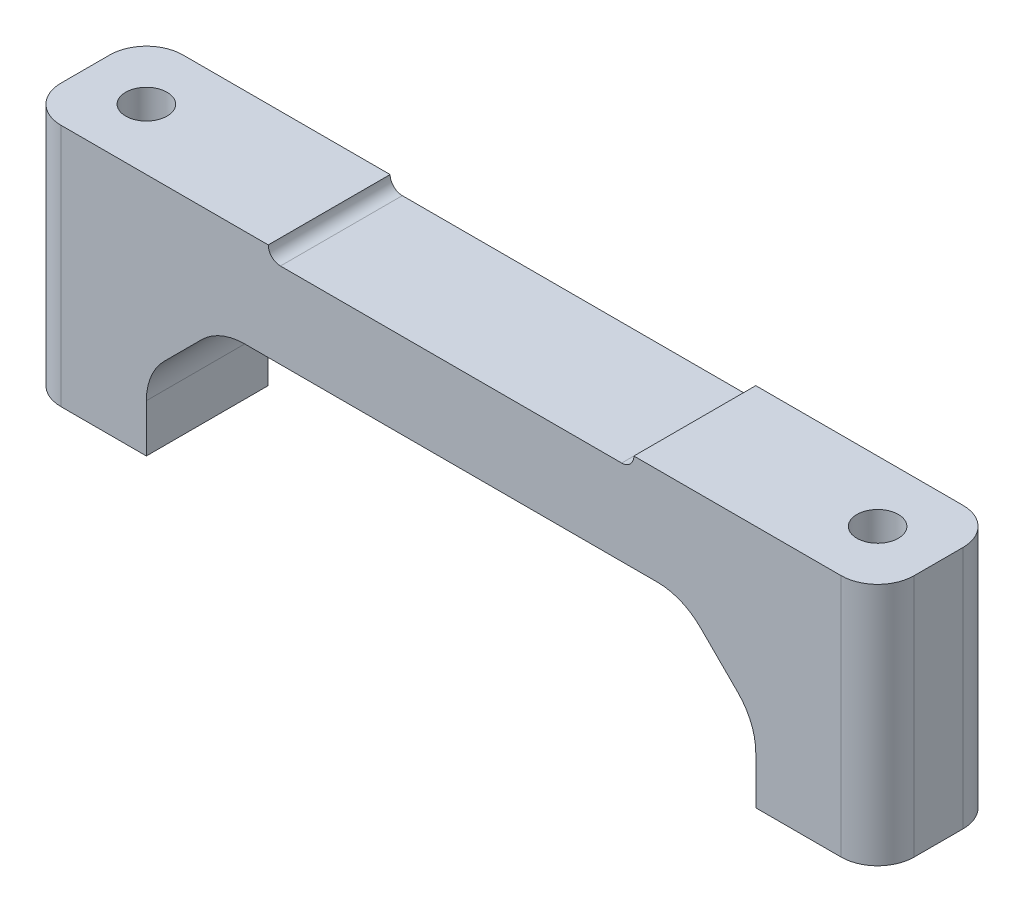
ISO-10303-21;
HEADER;
FILE_DESCRIPTION(('STEP AP214'),'2;1');
FILE_NAME('part.step','',(''),(''),'','','');
FILE_SCHEMA(('AUTOMOTIVE_DESIGN { 1 0 10303 214 1 1 1 1 }'));
ENDSEC;
DATA;
#1=APPLICATION_CONTEXT('core data for automotive mechanical design processes');
#2=APPLICATION_PROTOCOL_DEFINITION('international standard','automotive_design',2000,#1);
#3=PRODUCT_CONTEXT('',#1,'mechanical');
#4=PRODUCT('Part','Part','',(#3));
#5=PRODUCT_RELATED_PRODUCT_CATEGORY('part','',(#4));
#6=PRODUCT_DEFINITION_FORMATION('','',#4);
#7=PRODUCT_DEFINITION_CONTEXT('part definition',#1,'design');
#8=PRODUCT_DEFINITION('design','',#6,#7);
#9=PRODUCT_DEFINITION_SHAPE('','',#8);
#10=(LENGTH_UNIT() NAMED_UNIT(*) SI_UNIT(.MILLI.,.METRE.));
#11=(NAMED_UNIT(*) PLANE_ANGLE_UNIT() SI_UNIT($,.RADIAN.));
#12=(NAMED_UNIT(*) SI_UNIT($,.STERADIAN.) SOLID_ANGLE_UNIT());
#13=UNCERTAINTY_MEASURE_WITH_UNIT(LENGTH_MEASURE(1.E-05),#10,'distance_accuracy_value','');
#14=(GEOMETRIC_REPRESENTATION_CONTEXT(3) GLOBAL_UNCERTAINTY_ASSIGNED_CONTEXT((#13)) GLOBAL_UNIT_ASSIGNED_CONTEXT((#10,
#11,#12)) REPRESENTATION_CONTEXT('',''));
#15=CARTESIAN_POINT('',(0.,0.,0.));
#16=DIRECTION('',(0.,0.,1.));
#17=DIRECTION('',(1.,0.,0.));
#18=AXIS2_PLACEMENT_3D('',#15,#16,#17);
#19=CARTESIAN_POINT('',(0.,20.,0.));
#20=DIRECTION('',(0.,-1.,0.));
#21=DIRECTION('',(0.,0.,-1.));
#22=AXIS2_PLACEMENT_3D('',#19,#20,#21);
#23=PLANE('',#22);
#24=CARTESIAN_POINT('',(30.,20.,0.));
#25=DIRECTION('',(0.,1.,0.));
#26=DIRECTION('',(0.,0.,-1.));
#27=AXIS2_PLACEMENT_3D('',#24,#25,#26);
#28=CIRCLE('',#27,1.7);
#29=CARTESIAN_POINT('',(30.,20.,-1.7));
#30=VERTEX_POINT('',#29);
#31=EDGE_CURVE('E244',#30,#30,#28,.T.);
#32=ORIENTED_EDGE('',*,*,#31,.F.);
#33=EDGE_LOOP('',(#32));
#34=FACE_BOUND('',#33,.T.);
#35=DIRECTION('',(1.,0.,0.));
#36=VECTOR('',#35,1.);
#37=CARTESIAN_POINT('',(-35.,20.,5.));
#38=LINE('',#37,#36);
#39=CARTESIAN_POINT('',(15.0000000000001,20.,5.));
#40=VERTEX_POINT('',#39);
#41=CARTESIAN_POINT('',(32.,20.,5.));
#42=VERTEX_POINT('',#41);
#43=EDGE_CURVE('E264',#40,#42,#38,.T.);
#44=ORIENTED_EDGE('',*,*,#43,.T.);
#45=CARTESIAN_POINT('',(32.,20.,2.));
#46=DIRECTION('',(0.,-1.,0.));
#47=DIRECTION('',(0.,0.,-1.));
#48=AXIS2_PLACEMENT_3D('',#45,#46,#47);
#49=CIRCLE('',#48,3.);
#50=CARTESIAN_POINT('',(35.,20.,2.));
#51=VERTEX_POINT('',#50);
#52=EDGE_CURVE('E329',#42,#51,#49,.F.);
#53=ORIENTED_EDGE('',*,*,#52,.T.);
#54=DIRECTION('',(0.,0.,-1.));
#55=VECTOR('',#54,1.);
#56=CARTESIAN_POINT('',(35.,20.,5.));
#57=LINE('',#56,#55);
#58=CARTESIAN_POINT('',(35.,20.,-1.99999999999999));
#59=VERTEX_POINT('',#58);
#60=EDGE_CURVE('E259',#51,#59,#57,.T.);
#61=ORIENTED_EDGE('',*,*,#60,.T.);
#62=CARTESIAN_POINT('',(32.,20.,-1.99999999999999));
#63=DIRECTION('',(0.,-1.,0.));
#64=DIRECTION('',(0.,0.,-1.));
#65=AXIS2_PLACEMENT_3D('',#62,#63,#64);
#66=CIRCLE('',#65,3.);
#67=CARTESIAN_POINT('',(32.,20.,-4.99999999999999));
#68=VERTEX_POINT('',#67);
#69=EDGE_CURVE('E199',#59,#68,#66,.F.);
#70=ORIENTED_EDGE('',*,*,#69,.T.);
#71=DIRECTION('',(-1.,0.,0.));
#72=VECTOR('',#71,1.);
#73=CARTESIAN_POINT('',(-35.,20.,-4.99999999999999));
#74=LINE('',#73,#72);
#75=CARTESIAN_POINT('',(15.0000000000001,20.,-5.));
#76=VERTEX_POINT('',#75);
#77=EDGE_CURVE('E185',#68,#76,#74,.T.);
#78=ORIENTED_EDGE('',*,*,#77,.T.);
#79=DIRECTION('',(0.,0.,1.));
#80=VECTOR('',#79,1.);
#81=CARTESIAN_POINT('',(15.0000000000001,20.,-5.));
#82=LINE('',#81,#80);
#83=EDGE_CURVE('E195',#76,#40,#82,.T.);
#84=ORIENTED_EDGE('',*,*,#83,.T.);
#85=EDGE_LOOP('',(#44,#53,#61,#70,#78,#84));
#86=FACE_BOUND('',#85,.T.);
#87=ADVANCED_FACE('F33',(#34,#86),#23,.F.);
#88=CARTESIAN_POINT('',(0.,0.,0.));
#89=DIRECTION('',(0.,-1.,0.));
#90=DIRECTION('',(0.,0.,-1.));
#91=AXIS2_PLACEMENT_3D('',#88,#89,#90);
#92=PLANE('',#91);
#93=DIRECTION('',(0.,0.,1.));
#94=VECTOR('',#93,1.);
#95=CARTESIAN_POINT('',(-35.,0.,5.));
#96=LINE('',#95,#94);
#97=CARTESIAN_POINT('',(-35.,0.,-1.99999999999999));
#98=VERTEX_POINT('',#97);
#99=CARTESIAN_POINT('',(-35.,0.,2.));
#100=VERTEX_POINT('',#99);
#101=EDGE_CURVE('E274',#98,#100,#96,.T.);
#102=ORIENTED_EDGE('',*,*,#101,.F.);
#103=CARTESIAN_POINT('',(-32.,0.,-1.99999999999999));
#104=DIRECTION('',(0.,-1.,0.));
#105=DIRECTION('',(0.,0.,-1.));
#106=AXIS2_PLACEMENT_3D('',#103,#104,#105);
#107=CIRCLE('',#106,3.);
#108=CARTESIAN_POINT('',(-32.,0.,-4.99999999999999));
#109=VERTEX_POINT('',#108);
#110=EDGE_CURVE('E342',#98,#109,#107,.T.);
#111=ORIENTED_EDGE('',*,*,#110,.T.);
#112=DIRECTION('',(-1.,0.,0.));
#113=VECTOR('',#112,1.);
#114=CARTESIAN_POINT('',(-35.,0.,-4.99999999999999));
#115=LINE('',#114,#113);
#116=CARTESIAN_POINT('',(-25.,0.,-5.));
#117=VERTEX_POINT('',#116);
#118=EDGE_CURVE('E271',#117,#109,#115,.T.);
#119=ORIENTED_EDGE('',*,*,#118,.F.);
#120=DIRECTION('',(0.,0.,1.));
#121=VECTOR('',#120,1.);
#122=CARTESIAN_POINT('',(-25.,0.,-5.));
#123=LINE('',#122,#121);
#124=CARTESIAN_POINT('',(-25.,0.,5.));
#125=VERTEX_POINT('',#124);
#126=EDGE_CURVE('E228',#117,#125,#123,.T.);
#127=ORIENTED_EDGE('',*,*,#126,.T.);
#128=DIRECTION('',(1.,0.,0.));
#129=VECTOR('',#128,1.);
#130=CARTESIAN_POINT('',(-35.,0.,5.));
#131=LINE('',#130,#129);
#132=CARTESIAN_POINT('',(-32.,0.,5.));
#133=VERTEX_POINT('',#132);
#134=EDGE_CURVE('E260',#133,#125,#131,.T.);
#135=ORIENTED_EDGE('',*,*,#134,.F.);
#136=CARTESIAN_POINT('',(-32.,0.,2.));
#137=DIRECTION('',(0.,-1.,0.));
#138=DIRECTION('',(0.,0.,-1.));
#139=AXIS2_PLACEMENT_3D('',#136,#137,#138);
#140=CIRCLE('',#139,3.);
#141=EDGE_CURVE('E340',#133,#100,#140,.T.);
#142=ORIENTED_EDGE('',*,*,#141,.T.);
#143=EDGE_LOOP('',(#102,#111,#119,#127,#135,#142));
#144=FACE_BOUND('',#143,.T.);
#145=CARTESIAN_POINT('',(-30.,0.,0.));
#146=DIRECTION('',(0.,1.,0.));
#147=DIRECTION('',(0.,0.,1.));
#148=AXIS2_PLACEMENT_3D('',#145,#146,#147);
#149=CIRCLE('',#148,1.7);
#150=CARTESIAN_POINT('',(-30.,0.,1.7));
#151=VERTEX_POINT('',#150);
#152=EDGE_CURVE('E253',#151,#151,#149,.T.);
#153=ORIENTED_EDGE('',*,*,#152,.T.);
#154=EDGE_LOOP('',(#153));
#155=FACE_BOUND('',#154,.T.);
#156=ADVANCED_FACE('F381',(#144,#155),#92,.T.);
#157=CARTESIAN_POINT('',(35.,20.,5.));
#158=DIRECTION('',(-1.,0.,0.));
#159=DIRECTION('',(0.,0.,1.));
#160=AXIS2_PLACEMENT_3D('',#157,#158,#159);
#161=PLANE('',#160);
#162=ORIENTED_EDGE('',*,*,#60,.F.);
#163=DIRECTION('',(0.,-1.,0.));
#164=VECTOR('',#163,1.);
#165=CARTESIAN_POINT('',(35.,20.,2.));
#166=LINE('',#165,#164);
#167=CARTESIAN_POINT('',(35.,0.,2.));
#168=VERTEX_POINT('',#167);
#169=EDGE_CURVE('E316',#51,#168,#166,.T.);
#170=ORIENTED_EDGE('',*,*,#169,.T.);
#171=DIRECTION('',(0.,0.,-1.));
#172=VECTOR('',#171,1.);
#173=CARTESIAN_POINT('',(35.,0.,5.));
#174=LINE('',#173,#172);
#175=CARTESIAN_POINT('',(35.,0.,-1.99999999999999));
#176=VERTEX_POINT('',#175);
#177=EDGE_CURVE('E256',#168,#176,#174,.T.);
#178=ORIENTED_EDGE('',*,*,#177,.T.);
#179=DIRECTION('',(0.,-1.,0.));
#180=VECTOR('',#179,1.);
#181=CARTESIAN_POINT('',(35.,20.,-1.99999999999999));
#182=LINE('',#181,#180);
#183=EDGE_CURVE('E314',#176,#59,#182,.F.);
#184=ORIENTED_EDGE('',*,*,#183,.T.);
#185=EDGE_LOOP('',(#162,#170,#178,#184));
#186=FACE_BOUND('',#185,.T.);
#187=ADVANCED_FACE('F389',(#186),#161,.F.);
#188=CARTESIAN_POINT('',(-35.,20.,-4.99999999999999));
#189=DIRECTION('',(0.,0.,1.));
#190=DIRECTION('',(1.,0.,0.));
#191=AXIS2_PLACEMENT_3D('',#188,#189,#190);
#192=PLANE('',#191);
#193=ORIENTED_EDGE('',*,*,#77,.F.);
#194=DIRECTION('',(0.,-1.,0.));
#195=VECTOR('',#194,1.);
#196=CARTESIAN_POINT('',(32.,20.,-4.99999999999999));
#197=LINE('',#196,#195);
#198=CARTESIAN_POINT('',(32.,0.,-4.99999999999999));
#199=VERTEX_POINT('',#198);
#200=EDGE_CURVE('E333',#68,#199,#197,.T.);
#201=ORIENTED_EDGE('',*,*,#200,.T.);
#202=CARTESIAN_POINT('',(25.,0.,-4.99999999999999));
#203=VERTEX_POINT('',#202);
#204=EDGE_CURVE('E272',#199,#203,#115,.T.);
#205=ORIENTED_EDGE('',*,*,#204,.T.);
#206=DIRECTION('',(0.,1.,0.));
#207=VECTOR('',#206,1.);
#208=CARTESIAN_POINT('',(25.,0.,-5.));
#209=LINE('',#208,#207);
#210=CARTESIAN_POINT('',(25.,3.92893218813453,-5.));
#211=VERTEX_POINT('',#210);
#212=EDGE_CURVE('E215',#203,#211,#209,.T.);
#213=ORIENTED_EDGE('',*,*,#212,.T.);
#214=CARTESIAN_POINT('',(20.,3.92893218813452,-4.99999999999999));
#215=DIRECTION('',(0.,0.,1.));
#216=DIRECTION('',(1.,0.,0.));
#217=AXIS2_PLACEMENT_3D('',#214,#215,#216);
#218=CIRCLE('',#217,5.);
#219=CARTESIAN_POINT('',(23.5355339059327,7.46446609406727,-5.));
#220=VERTEX_POINT('',#219);
#221=EDGE_CURVE('E300',#211,#220,#218,.T.);
#222=ORIENTED_EDGE('',*,*,#221,.T.);
#223=DIRECTION('',(-0.707106781186548,0.707106781186547,0.));
#224=VECTOR('',#223,1.);
#225=CARTESIAN_POINT('',(25.,6.,-5.));
#226=LINE('',#225,#224);
#227=CARTESIAN_POINT('',(20.4644660940673,10.5355339059327,-5.));
#228=VERTEX_POINT('',#227);
#229=EDGE_CURVE('E219',#220,#228,#226,.T.);
#230=ORIENTED_EDGE('',*,*,#229,.T.);
#231=CARTESIAN_POINT('',(16.9289321881345,7.,-4.99999999999999));
#232=DIRECTION('',(0.,0.,1.));
#233=DIRECTION('',(1.,0.,0.));
#234=AXIS2_PLACEMENT_3D('',#231,#232,#233);
#235=CIRCLE('',#234,5.);
#236=CARTESIAN_POINT('',(16.9289321881345,12.,-5.));
#237=VERTEX_POINT('',#236);
#238=EDGE_CURVE('E304',#228,#237,#235,.T.);
#239=ORIENTED_EDGE('',*,*,#238,.T.);
#240=DIRECTION('',(-1.,0.,0.));
#241=VECTOR('',#240,1.);
#242=CARTESIAN_POINT('',(-19.,12.,-5.));
#243=LINE('',#242,#241);
#244=CARTESIAN_POINT('',(-16.9289321881345,12.,-5.));
#245=VERTEX_POINT('',#244);
#246=EDGE_CURVE('E222',#237,#245,#243,.T.);
#247=ORIENTED_EDGE('',*,*,#246,.T.);
#248=CARTESIAN_POINT('',(-16.9289321881345,7.,-4.99999999999999));
#249=DIRECTION('',(0.,0.,1.));
#250=DIRECTION('',(1.,0.,0.));
#251=AXIS2_PLACEMENT_3D('',#248,#249,#250);
#252=CIRCLE('',#251,5.);
#253=CARTESIAN_POINT('',(-20.4644660940673,10.5355339059327,-5.));
#254=VERTEX_POINT('',#253);
#255=EDGE_CURVE('E312',#245,#254,#252,.T.);
#256=ORIENTED_EDGE('',*,*,#255,.T.);
#257=DIRECTION('',(-0.707106781186547,-0.707106781186548,0.));
#258=VECTOR('',#257,1.);
#259=CARTESIAN_POINT('',(-25.,6.,-5.));
#260=LINE('',#259,#258);
#261=CARTESIAN_POINT('',(-23.5355339059327,7.46446609406726,-5.));
#262=VERTEX_POINT('',#261);
#263=EDGE_CURVE('E225',#254,#262,#260,.T.);
#264=ORIENTED_EDGE('',*,*,#263,.T.);
#265=CARTESIAN_POINT('',(-20.,3.92893218813453,-4.99999999999999));
#266=DIRECTION('',(0.,0.,1.));
#267=DIRECTION('',(1.,0.,0.));
#268=AXIS2_PLACEMENT_3D('',#265,#266,#267);
#269=CIRCLE('',#268,5.);
#270=CARTESIAN_POINT('',(-25.,3.92893218813453,-5.));
#271=VERTEX_POINT('',#270);
#272=EDGE_CURVE('E308',#262,#271,#269,.T.);
#273=ORIENTED_EDGE('',*,*,#272,.T.);
#274=DIRECTION('',(0.,-1.,0.));
#275=VECTOR('',#274,1.);
#276=CARTESIAN_POINT('',(-25.,0.,-5.));
#277=LINE('',#276,#275);
#278=EDGE_CURVE('E213',#271,#117,#277,.T.);
#279=ORIENTED_EDGE('',*,*,#278,.T.);
#280=ORIENTED_EDGE('',*,*,#118,.T.);
#281=DIRECTION('',(0.,-1.,0.));
#282=VECTOR('',#281,1.);
#283=CARTESIAN_POINT('',(-32.,20.,-4.99999999999999));
#284=LINE('',#283,#282);
#285=CARTESIAN_POINT('',(-32.,20.,-4.99999999999999));
#286=VERTEX_POINT('',#285);
#287=EDGE_CURVE('E331',#109,#286,#284,.F.);
#288=ORIENTED_EDGE('',*,*,#287,.T.);
#289=CARTESIAN_POINT('',(-14.9999999999999,20.,-4.99999999999999));
#290=VERTEX_POINT('',#289);
#291=EDGE_CURVE('E201',#290,#286,#74,.T.);
#292=ORIENTED_EDGE('',*,*,#291,.F.);
#293=CARTESIAN_POINT('',(-13.9999999999999,20.,-4.99999999999999));
#294=DIRECTION('',(0.,0.,1.));
#295=DIRECTION('',(1.,0.,0.));
#296=AXIS2_PLACEMENT_3D('',#293,#294,#295);
#297=CIRCLE('',#296,1.);
#298=CARTESIAN_POINT('',(-13.9999999999999,19.,-5.));
#299=VERTEX_POINT('',#298);
#300=EDGE_CURVE('E11',#290,#299,#297,.T.);
#301=ORIENTED_EDGE('',*,*,#300,.T.);
#302=DIRECTION('',(1.,0.,0.));
#303=VECTOR('',#302,1.);
#304=CARTESIAN_POINT('',(-14.9999999999999,19.,-5.));
#305=LINE('',#304,#303);
#306=CARTESIAN_POINT('',(14.0000000000001,19.,-5.));
#307=VERTEX_POINT('',#306);
#308=EDGE_CURVE('E187',#299,#307,#305,.T.);
#309=ORIENTED_EDGE('',*,*,#308,.T.);
#310=CARTESIAN_POINT('',(14.0000000000001,20.,-4.99999999999999));
#311=DIRECTION('',(0.,0.,1.));
#312=DIRECTION('',(1.,0.,0.));
#313=AXIS2_PLACEMENT_3D('',#310,#311,#312);
#314=CIRCLE('',#313,1.);
#315=EDGE_CURVE('E181',#307,#76,#314,.T.);
#316=ORIENTED_EDGE('',*,*,#315,.T.);
#317=EDGE_LOOP('',(#193,#201,#205,#213,#222,#230,#239,#247,#256,#264,#273,#279,#280,#288,#292,
#301,#309,#316));
#318=FACE_BOUND('',#317,.T.);
#319=ADVANCED_FACE('F183',(#318),#192,.F.);
#320=CARTESIAN_POINT('',(-35.,20.,5.));
#321=DIRECTION('',(1.,0.,0.));
#322=DIRECTION('',(0.,0.,-1.));
#323=AXIS2_PLACEMENT_3D('',#320,#321,#322);
#324=PLANE('',#323);
#325=DIRECTION('',(0.,0.,1.));
#326=VECTOR('',#325,1.);
#327=CARTESIAN_POINT('',(-35.,20.,5.));
#328=LINE('',#327,#326);
#329=CARTESIAN_POINT('',(-35.,20.,-1.99999999999999));
#330=VERTEX_POINT('',#329);
#331=CARTESIAN_POINT('',(-35.,20.,2.));
#332=VERTEX_POINT('',#331);
#333=EDGE_CURVE('E200',#330,#332,#328,.T.);
#334=ORIENTED_EDGE('',*,*,#333,.F.);
#335=DIRECTION('',(0.,-1.,0.));
#336=VECTOR('',#335,1.);
#337=CARTESIAN_POINT('',(-35.,20.,-1.99999999999999));
#338=LINE('',#337,#336);
#339=EDGE_CURVE('E337',#330,#98,#338,.T.);
#340=ORIENTED_EDGE('',*,*,#339,.T.);
#341=ORIENTED_EDGE('',*,*,#101,.T.);
#342=DIRECTION('',(0.,-1.,0.));
#343=VECTOR('',#342,1.);
#344=CARTESIAN_POINT('',(-35.,20.,2.));
#345=LINE('',#344,#343);
#346=EDGE_CURVE('E335',#100,#332,#345,.F.);
#347=ORIENTED_EDGE('',*,*,#346,.T.);
#348=EDGE_LOOP('',(#334,#340,#341,#347));
#349=FACE_BOUND('',#348,.T.);
#350=ADVANCED_FACE('F403',(#349),#324,.F.);
#351=CARTESIAN_POINT('',(-35.,20.,5.));
#352=DIRECTION('',(0.,0.,-1.));
#353=DIRECTION('',(-1.,0.,0.));
#354=AXIS2_PLACEMENT_3D('',#351,#352,#353);
#355=PLANE('',#354);
#356=CARTESIAN_POINT('',(25.,0.,5.));
#357=VERTEX_POINT('',#356);
#358=CARTESIAN_POINT('',(32.,0.,5.));
#359=VERTEX_POINT('',#358);
#360=EDGE_CURVE('E277',#357,#359,#131,.T.);
#361=ORIENTED_EDGE('',*,*,#360,.T.);
#362=DIRECTION('',(0.,-1.,0.));
#363=VECTOR('',#362,1.);
#364=CARTESIAN_POINT('',(32.,20.,5.));
#365=LINE('',#364,#363);
#366=EDGE_CURVE('E326',#359,#42,#365,.F.);
#367=ORIENTED_EDGE('',*,*,#366,.T.);
#368=ORIENTED_EDGE('',*,*,#43,.F.);
#369=CARTESIAN_POINT('',(14.0000000000001,20.,5.));
#370=DIRECTION('',(0.,0.,-1.));
#371=DIRECTION('',(-1.,0.,0.));
#372=AXIS2_PLACEMENT_3D('',#369,#370,#371);
#373=CIRCLE('',#372,1.);
#374=CARTESIAN_POINT('',(14.0000000000001,19.,5.));
#375=VERTEX_POINT('',#374);
#376=EDGE_CURVE('E190',#40,#375,#373,.T.);
#377=ORIENTED_EDGE('',*,*,#376,.T.);
#378=DIRECTION('',(1.,0.,0.));
#379=VECTOR('',#378,1.);
#380=CARTESIAN_POINT('',(-14.9999999999999,19.,5.));
#381=LINE('',#380,#379);
#382=CARTESIAN_POINT('',(-13.9999999999999,19.,5.));
#383=VERTEX_POINT('',#382);
#384=EDGE_CURVE('E209',#383,#375,#381,.T.);
#385=ORIENTED_EDGE('',*,*,#384,.F.);
#386=CARTESIAN_POINT('',(-13.9999999999999,20.,5.));
#387=DIRECTION('',(0.,0.,-1.));
#388=DIRECTION('',(-1.,0.,0.));
#389=AXIS2_PLACEMENT_3D('',#386,#387,#388);
#390=CIRCLE('',#389,1.);
#391=CARTESIAN_POINT('',(-14.9999999999999,20.,5.));
#392=VERTEX_POINT('',#391);
#393=EDGE_CURVE('E41',#383,#392,#390,.T.);
#394=ORIENTED_EDGE('',*,*,#393,.T.);
#395=CARTESIAN_POINT('',(-32.,20.,5.));
#396=VERTEX_POINT('',#395);
#397=EDGE_CURVE('E265',#396,#392,#38,.T.);
#398=ORIENTED_EDGE('',*,*,#397,.F.);
#399=DIRECTION('',(0.,-1.,0.));
#400=VECTOR('',#399,1.);
#401=CARTESIAN_POINT('',(-32.,20.,5.));
#402=LINE('',#401,#400);
#403=EDGE_CURVE('E323',#396,#133,#402,.T.);
#404=ORIENTED_EDGE('',*,*,#403,.T.);
#405=ORIENTED_EDGE('',*,*,#134,.T.);
#406=DIRECTION('',(0.,-1.,0.));
#407=VECTOR('',#406,1.);
#408=CARTESIAN_POINT('',(-25.,0.,5.));
#409=LINE('',#408,#407);
#410=CARTESIAN_POINT('',(-25.,3.92893218813453,5.));
#411=VERTEX_POINT('',#410);
#412=EDGE_CURVE('E207',#411,#125,#409,.T.);
#413=ORIENTED_EDGE('',*,*,#412,.F.);
#414=CARTESIAN_POINT('',(-20.,3.92893218813453,5.));
#415=DIRECTION('',(0.,0.,-1.));
#416=DIRECTION('',(-1.,0.,0.));
#417=AXIS2_PLACEMENT_3D('',#414,#415,#416);
#418=CIRCLE('',#417,5.);
#419=CARTESIAN_POINT('',(-23.5355339059327,7.46446609406726,5.));
#420=VERTEX_POINT('',#419);
#421=EDGE_CURVE('E306',#411,#420,#418,.T.);
#422=ORIENTED_EDGE('',*,*,#421,.T.);
#423=DIRECTION('',(-0.707106781186547,-0.707106781186548,0.));
#424=VECTOR('',#423,1.);
#425=CARTESIAN_POINT('',(-25.,6.,5.));
#426=LINE('',#425,#424);
#427=CARTESIAN_POINT('',(-20.4644660940673,10.5355339059327,5.));
#428=VERTEX_POINT('',#427);
#429=EDGE_CURVE('E216',#428,#420,#426,.T.);
#430=ORIENTED_EDGE('',*,*,#429,.F.);
#431=CARTESIAN_POINT('',(-16.9289321881345,7.,5.));
#432=DIRECTION('',(0.,0.,-1.));
#433=DIRECTION('',(-1.,0.,0.));
#434=AXIS2_PLACEMENT_3D('',#431,#432,#433);
#435=CIRCLE('',#434,5.);
#436=CARTESIAN_POINT('',(-16.9289321881345,12.,5.));
#437=VERTEX_POINT('',#436);
#438=EDGE_CURVE('E310',#428,#437,#435,.T.);
#439=ORIENTED_EDGE('',*,*,#438,.T.);
#440=DIRECTION('',(-1.,0.,0.));
#441=VECTOR('',#440,1.);
#442=CARTESIAN_POINT('',(-19.,12.,5.));
#443=LINE('',#442,#441);
#444=CARTESIAN_POINT('',(16.9289321881345,12.,5.));
#445=VERTEX_POINT('',#444);
#446=EDGE_CURVE('E237',#445,#437,#443,.T.);
#447=ORIENTED_EDGE('',*,*,#446,.F.);
#448=CARTESIAN_POINT('',(16.9289321881345,7.,5.));
#449=DIRECTION('',(0.,0.,-1.));
#450=DIRECTION('',(-1.,0.,0.));
#451=AXIS2_PLACEMENT_3D('',#448,#449,#450);
#452=CIRCLE('',#451,5.);
#453=CARTESIAN_POINT('',(20.4644660940673,10.5355339059327,5.));
#454=VERTEX_POINT('',#453);
#455=EDGE_CURVE('E302',#445,#454,#452,.T.);
#456=ORIENTED_EDGE('',*,*,#455,.T.);
#457=DIRECTION('',(-0.707106781186548,0.707106781186547,0.));
#458=VECTOR('',#457,1.);
#459=CARTESIAN_POINT('',(25.,6.,5.));
#460=LINE('',#459,#458);
#461=CARTESIAN_POINT('',(23.5355339059327,7.46446609406727,5.));
#462=VERTEX_POINT('',#461);
#463=EDGE_CURVE('E234',#462,#454,#460,.T.);
#464=ORIENTED_EDGE('',*,*,#463,.F.);
#465=CARTESIAN_POINT('',(20.,3.92893218813452,5.));
#466=DIRECTION('',(0.,0.,-1.));
#467=DIRECTION('',(-1.,0.,0.));
#468=AXIS2_PLACEMENT_3D('',#465,#466,#467);
#469=CIRCLE('',#468,5.);
#470=CARTESIAN_POINT('',(25.,3.92893218813453,5.));
#471=VERTEX_POINT('',#470);
#472=EDGE_CURVE('E298',#462,#471,#469,.T.);
#473=ORIENTED_EDGE('',*,*,#472,.T.);
#474=DIRECTION('',(0.,1.,0.));
#475=VECTOR('',#474,1.);
#476=CARTESIAN_POINT('',(25.,0.,5.));
#477=LINE('',#476,#475);
#478=EDGE_CURVE('E231',#357,#471,#477,.T.);
#479=ORIENTED_EDGE('',*,*,#478,.F.);
#480=EDGE_LOOP('',(#361,#367,#368,#377,#385,#394,#398,#404,#405,#413,#422,#430,#439,#447,#456,
#464,#473,#479));
#481=FACE_BOUND('',#480,.T.);
#482=ADVANCED_FACE('F356',(#481),#355,.F.);
#483=CARTESIAN_POINT('',(-30.,20.,0.));
#484=DIRECTION('',(0.,1.,0.));
#485=DIRECTION('',(0.,0.,1.));
#486=AXIS2_PLACEMENT_3D('',#483,#484,#485);
#487=CIRCLE('',#486,1.7);
#488=CARTESIAN_POINT('',(-30.,20.,1.7));
#489=VERTEX_POINT('',#488);
#490=EDGE_CURVE('E250',#489,#489,#487,.T.);
#491=ORIENTED_EDGE('',*,*,#490,.F.);
#492=EDGE_LOOP('',(#491));
#493=FACE_BOUND('',#492,.T.);
#494=ORIENTED_EDGE('',*,*,#291,.T.);
#495=CARTESIAN_POINT('',(-32.,20.,-1.99999999999999));
#496=DIRECTION('',(0.,-1.,0.));
#497=DIRECTION('',(0.,0.,-1.));
#498=AXIS2_PLACEMENT_3D('',#495,#496,#497);
#499=CIRCLE('',#498,3.);
#500=EDGE_CURVE('E346',#286,#330,#499,.F.);
#501=ORIENTED_EDGE('',*,*,#500,.T.);
#502=ORIENTED_EDGE('',*,*,#333,.T.);
#503=CARTESIAN_POINT('',(-32.,20.,2.));
#504=DIRECTION('',(0.,-1.,0.));
#505=DIRECTION('',(0.,0.,-1.));
#506=AXIS2_PLACEMENT_3D('',#503,#504,#505);
#507=CIRCLE('',#506,3.);
#508=EDGE_CURVE('E344',#332,#396,#507,.F.);
#509=ORIENTED_EDGE('',*,*,#508,.T.);
#510=ORIENTED_EDGE('',*,*,#397,.T.);
#511=DIRECTION('',(0.,0.,1.));
#512=VECTOR('',#511,1.);
#513=CARTESIAN_POINT('',(-14.9999999999999,20.,-5.));
#514=LINE('',#513,#512);
#515=EDGE_CURVE('E204',#290,#392,#514,.T.);
#516=ORIENTED_EDGE('',*,*,#515,.F.);
#517=EDGE_LOOP('',(#494,#501,#502,#509,#510,#516));
#518=FACE_BOUND('',#517,.T.);
#519=ADVANCED_FACE('F362',(#493,#518),#23,.F.);
#520=ORIENTED_EDGE('',*,*,#177,.F.);
#521=CARTESIAN_POINT('',(32.,0.,2.));
#522=DIRECTION('',(0.,-1.,0.));
#523=DIRECTION('',(0.,0.,-1.));
#524=AXIS2_PLACEMENT_3D('',#521,#522,#523);
#525=CIRCLE('',#524,3.);
#526=EDGE_CURVE('E321',#168,#359,#525,.T.);
#527=ORIENTED_EDGE('',*,*,#526,.T.);
#528=ORIENTED_EDGE('',*,*,#360,.F.);
#529=DIRECTION('',(0.,0.,1.));
#530=VECTOR('',#529,1.);
#531=CARTESIAN_POINT('',(25.,0.,-5.));
#532=LINE('',#531,#530);
#533=EDGE_CURVE('E242',#203,#357,#532,.T.);
#534=ORIENTED_EDGE('',*,*,#533,.F.);
#535=ORIENTED_EDGE('',*,*,#204,.F.);
#536=CARTESIAN_POINT('',(32.,0.,-1.99999999999999));
#537=DIRECTION('',(0.,-1.,0.));
#538=DIRECTION('',(0.,0.,-1.));
#539=AXIS2_PLACEMENT_3D('',#536,#537,#538);
#540=CIRCLE('',#539,3.);
#541=EDGE_CURVE('E319',#199,#176,#540,.T.);
#542=ORIENTED_EDGE('',*,*,#541,.T.);
#543=EDGE_LOOP('',(#520,#527,#528,#534,#535,#542));
#544=FACE_BOUND('',#543,.T.);
#545=CARTESIAN_POINT('',(30.,0.,0.));
#546=DIRECTION('',(0.,1.,0.));
#547=DIRECTION('',(0.,0.,-1.));
#548=AXIS2_PLACEMENT_3D('',#545,#546,#547);
#549=CIRCLE('',#548,1.7);
#550=CARTESIAN_POINT('',(30.,0.,-1.7));
#551=VERTEX_POINT('',#550);
#552=EDGE_CURVE('E247',#551,#551,#549,.T.);
#553=ORIENTED_EDGE('',*,*,#552,.T.);
#554=EDGE_LOOP('',(#553));
#555=FACE_BOUND('',#554,.T.);
#556=ADVANCED_FACE('F392',(#544,#555),#92,.T.);
#557=CARTESIAN_POINT('',(-30.,0.,0.));
#558=DIRECTION('',(0.,1.,0.));
#559=DIRECTION('',(0.,0.,1.));
#560=AXIS2_PLACEMENT_3D('',#557,#558,#559);
#561=CYLINDRICAL_SURFACE('',#560,1.7);
#562=ORIENTED_EDGE('',*,*,#152,.F.);
#563=EDGE_LOOP('',(#562));
#564=FACE_BOUND('',#563,.T.);
#565=ORIENTED_EDGE('',*,*,#490,.T.);
#566=EDGE_LOOP('',(#565));
#567=FACE_BOUND('',#566,.T.);
#568=ADVANCED_FACE('F401',(#564,#567),#561,.F.);
#569=CARTESIAN_POINT('',(30.,0.,0.));
#570=DIRECTION('',(0.,1.,0.));
#571=DIRECTION('',(0.,0.,1.));
#572=AXIS2_PLACEMENT_3D('',#569,#570,#571);
#573=CYLINDRICAL_SURFACE('',#572,1.7);
#574=ORIENTED_EDGE('',*,*,#552,.F.);
#575=EDGE_LOOP('',(#574));
#576=FACE_BOUND('',#575,.T.);
#577=ORIENTED_EDGE('',*,*,#31,.T.);
#578=EDGE_LOOP('',(#577));
#579=FACE_BOUND('',#578,.T.);
#580=ADVANCED_FACE('F408',(#576,#579),#573,.F.);
#581=CARTESIAN_POINT('',(-25.,0.,-5.));
#582=DIRECTION('',(-1.,0.,0.));
#583=DIRECTION('',(0.,-1.,0.));
#584=AXIS2_PLACEMENT_3D('',#581,#582,#583);
#585=PLANE('',#584);
#586=ORIENTED_EDGE('',*,*,#278,.F.);
#587=DIRECTION('',(0.,0.,1.));
#588=VECTOR('',#587,1.);
#589=CARTESIAN_POINT('',(-25.,3.92893218813453,5.));
#590=LINE('',#589,#588);
#591=EDGE_CURVE('E290',#271,#411,#590,.T.);
#592=ORIENTED_EDGE('',*,*,#591,.T.);
#593=ORIENTED_EDGE('',*,*,#412,.T.);
#594=ORIENTED_EDGE('',*,*,#126,.F.);
#595=EDGE_LOOP('',(#586,#592,#593,#594));
#596=FACE_BOUND('',#595,.T.);
#597=ADVANCED_FACE('F414',(#596),#585,.F.);
#598=CARTESIAN_POINT('',(-25.,6.,-5.));
#599=DIRECTION('',(-0.707106781186548,0.707106781186547,0.));
#600=DIRECTION('',(-0.707106781186547,-0.707106781186548,0.));
#601=AXIS2_PLACEMENT_3D('',#598,#599,#600);
#602=PLANE('',#601);
#603=ORIENTED_EDGE('',*,*,#429,.T.);
#604=DIRECTION('',(0.,0.,1.));
#605=VECTOR('',#604,1.);
#606=CARTESIAN_POINT('',(-23.5355339059327,7.46446609406726,-5.));
#607=LINE('',#606,#605);
#608=EDGE_CURVE('E296',#420,#262,#607,.F.);
#609=ORIENTED_EDGE('',*,*,#608,.T.);
#610=ORIENTED_EDGE('',*,*,#263,.F.);
#611=DIRECTION('',(0.,0.,1.));
#612=VECTOR('',#611,1.);
#613=CARTESIAN_POINT('',(-20.4644660940673,10.5355339059327,5.));
#614=LINE('',#613,#612);
#615=EDGE_CURVE('E293',#254,#428,#614,.T.);
#616=ORIENTED_EDGE('',*,*,#615,.T.);
#617=EDGE_LOOP('',(#603,#609,#610,#616));
#618=FACE_BOUND('',#617,.T.);
#619=ADVANCED_FACE('F420',(#618),#602,.F.);
#620=CARTESIAN_POINT('',(-19.,12.,-5.));
#621=DIRECTION('',(0.,1.,0.));
#622=DIRECTION('',(0.,0.,1.));
#623=AXIS2_PLACEMENT_3D('',#620,#621,#622);
#624=PLANE('',#623);
#625=ORIENTED_EDGE('',*,*,#246,.F.);
#626=DIRECTION('',(0.,0.,1.));
#627=VECTOR('',#626,1.);
#628=CARTESIAN_POINT('',(16.9289321881345,12.,5.));
#629=LINE('',#628,#627);
#630=EDGE_CURVE('E287',#237,#445,#629,.T.);
#631=ORIENTED_EDGE('',*,*,#630,.T.);
#632=ORIENTED_EDGE('',*,*,#446,.T.);
#633=DIRECTION('',(0.,0.,1.));
#634=VECTOR('',#633,1.);
#635=CARTESIAN_POINT('',(-16.9289321881345,12.,-5.));
#636=LINE('',#635,#634);
#637=EDGE_CURVE('E285',#437,#245,#636,.F.);
#638=ORIENTED_EDGE('',*,*,#637,.T.);
#639=EDGE_LOOP('',(#625,#631,#632,#638));
#640=FACE_BOUND('',#639,.T.);
#641=ADVANCED_FACE('F425',(#640),#624,.F.);
#642=CARTESIAN_POINT('',(25.,6.,-5.));
#643=DIRECTION('',(0.707106781186547,0.707106781186548,0.));
#644=DIRECTION('',(-0.707106781186548,0.707106781186547,0.));
#645=AXIS2_PLACEMENT_3D('',#642,#643,#644);
#646=PLANE('',#645);
#647=ORIENTED_EDGE('',*,*,#229,.F.);
#648=DIRECTION('',(0.,0.,1.));
#649=VECTOR('',#648,1.);
#650=CARTESIAN_POINT('',(23.5355339059327,7.46446609406727,5.));
#651=LINE('',#650,#649);
#652=EDGE_CURVE('E280',#220,#462,#651,.T.);
#653=ORIENTED_EDGE('',*,*,#652,.T.);
#654=ORIENTED_EDGE('',*,*,#463,.T.);
#655=DIRECTION('',(0.,0.,1.));
#656=VECTOR('',#655,1.);
#657=CARTESIAN_POINT('',(20.4644660940673,10.5355339059327,-5.));
#658=LINE('',#657,#656);
#659=EDGE_CURVE('E268',#454,#228,#658,.F.);
#660=ORIENTED_EDGE('',*,*,#659,.T.);
#661=EDGE_LOOP('',(#647,#653,#654,#660));
#662=FACE_BOUND('',#661,.T.);
#663=ADVANCED_FACE('F376',(#662),#646,.F.);
#664=CARTESIAN_POINT('',(25.,0.,-5.));
#665=DIRECTION('',(1.,0.,0.));
#666=DIRECTION('',(0.,1.,0.));
#667=AXIS2_PLACEMENT_3D('',#664,#665,#666);
#668=PLANE('',#667);
#669=ORIENTED_EDGE('',*,*,#478,.T.);
#670=DIRECTION('',(0.,0.,1.));
#671=VECTOR('',#670,1.);
#672=CARTESIAN_POINT('',(25.,3.92893218813453,-5.));
#673=LINE('',#672,#671);
#674=EDGE_CURVE('E283',#471,#211,#673,.F.);
#675=ORIENTED_EDGE('',*,*,#674,.T.);
#676=ORIENTED_EDGE('',*,*,#212,.F.);
#677=ORIENTED_EDGE('',*,*,#533,.T.);
#678=EDGE_LOOP('',(#669,#675,#676,#677));
#679=FACE_BOUND('',#678,.T.);
#680=ADVANCED_FACE('F367',(#679),#668,.F.);
#681=CARTESIAN_POINT('',(-14.9999999999999,19.,-5.));
#682=DIRECTION('',(0.,-1.,0.));
#683=DIRECTION('',(0.,0.,-1.));
#684=AXIS2_PLACEMENT_3D('',#681,#682,#683);
#685=PLANE('',#684);
#686=ORIENTED_EDGE('',*,*,#384,.T.);
#687=DIRECTION('',(0.,0.,1.));
#688=VECTOR('',#687,1.);
#689=CARTESIAN_POINT('',(14.0000000000001,19.,-5.));
#690=LINE('',#689,#688);
#691=EDGE_CURVE('E48',#375,#307,#690,.F.);
#692=ORIENTED_EDGE('',*,*,#691,.T.);
#693=ORIENTED_EDGE('',*,*,#308,.F.);
#694=DIRECTION('',(0.,0.,1.));
#695=VECTOR('',#694,1.);
#696=CARTESIAN_POINT('',(-13.9999999999999,19.,5.));
#697=LINE('',#696,#695);
#698=EDGE_CURVE('E348',#299,#383,#697,.T.);
#699=ORIENTED_EDGE('',*,*,#698,.T.);
#700=EDGE_LOOP('',(#686,#692,#693,#699));
#701=FACE_BOUND('',#700,.T.);
#702=ADVANCED_FACE('F364',(#701),#685,.F.);
#703=CARTESIAN_POINT('',(20.,3.92893218813452,-5.));
#704=DIRECTION('',(0.,0.,-1.));
#705=DIRECTION('',(-1.,0.,0.));
#706=AXIS2_PLACEMENT_3D('',#703,#704,#705);
#707=CYLINDRICAL_SURFACE('',#706,5.);
#708=ORIENTED_EDGE('',*,*,#221,.F.);
#709=ORIENTED_EDGE('',*,*,#674,.F.);
#710=ORIENTED_EDGE('',*,*,#472,.F.);
#711=ORIENTED_EDGE('',*,*,#652,.F.);
#712=EDGE_LOOP('',(#708,#709,#710,#711));
#713=FACE_BOUND('',#712,.T.);
#714=ADVANCED_FACE('F366',(#713),#707,.F.);
#715=CARTESIAN_POINT('',(16.9289321881345,7.,-5.));
#716=DIRECTION('',(0.,0.,-1.));
#717=DIRECTION('',(-1.,0.,0.));
#718=AXIS2_PLACEMENT_3D('',#715,#716,#717);
#719=CYLINDRICAL_SURFACE('',#718,5.);
#720=ORIENTED_EDGE('',*,*,#238,.F.);
#721=ORIENTED_EDGE('',*,*,#659,.F.);
#722=ORIENTED_EDGE('',*,*,#455,.F.);
#723=ORIENTED_EDGE('',*,*,#630,.F.);
#724=EDGE_LOOP('',(#720,#721,#722,#723));
#725=FACE_BOUND('',#724,.T.);
#726=ADVANCED_FACE('F373',(#725),#719,.F.);
#727=CARTESIAN_POINT('',(-20.,3.92893218813453,-5.));
#728=DIRECTION('',(0.,0.,-1.));
#729=DIRECTION('',(-1.,0.,0.));
#730=AXIS2_PLACEMENT_3D('',#727,#728,#729);
#731=CYLINDRICAL_SURFACE('',#730,5.);
#732=ORIENTED_EDGE('',*,*,#272,.F.);
#733=ORIENTED_EDGE('',*,*,#608,.F.);
#734=ORIENTED_EDGE('',*,*,#421,.F.);
#735=ORIENTED_EDGE('',*,*,#591,.F.);
#736=EDGE_LOOP('',(#732,#733,#734,#735));
#737=FACE_BOUND('',#736,.T.);
#738=ADVANCED_FACE('F439',(#737),#731,.F.);
#739=CARTESIAN_POINT('',(-16.9289321881345,7.,-5.));
#740=DIRECTION('',(0.,0.,-1.));
#741=DIRECTION('',(-1.,0.,0.));
#742=AXIS2_PLACEMENT_3D('',#739,#740,#741);
#743=CYLINDRICAL_SURFACE('',#742,5.);
#744=ORIENTED_EDGE('',*,*,#255,.F.);
#745=ORIENTED_EDGE('',*,*,#637,.F.);
#746=ORIENTED_EDGE('',*,*,#438,.F.);
#747=ORIENTED_EDGE('',*,*,#615,.F.);
#748=EDGE_LOOP('',(#744,#745,#746,#747));
#749=FACE_BOUND('',#748,.T.);
#750=ADVANCED_FACE('F473',(#749),#743,.F.);
#751=CARTESIAN_POINT('',(32.,20.,2.));
#752=DIRECTION('',(0.,-1.,0.));
#753=DIRECTION('',(0.,0.,-1.));
#754=AXIS2_PLACEMENT_3D('',#751,#752,#753);
#755=CYLINDRICAL_SURFACE('',#754,3.);
#756=ORIENTED_EDGE('',*,*,#52,.F.);
#757=ORIENTED_EDGE('',*,*,#366,.F.);
#758=ORIENTED_EDGE('',*,*,#526,.F.);
#759=ORIENTED_EDGE('',*,*,#169,.F.);
#760=EDGE_LOOP('',(#756,#757,#758,#759));
#761=FACE_BOUND('',#760,.T.);
#762=ADVANCED_FACE('F469',(#761),#755,.T.);
#763=CARTESIAN_POINT('',(32.,20.,-1.99999999999999));
#764=DIRECTION('',(0.,-1.,0.));
#765=DIRECTION('',(0.,0.,-1.));
#766=AXIS2_PLACEMENT_3D('',#763,#764,#765);
#767=CYLINDRICAL_SURFACE('',#766,3.);
#768=ORIENTED_EDGE('',*,*,#69,.F.);
#769=ORIENTED_EDGE('',*,*,#183,.F.);
#770=ORIENTED_EDGE('',*,*,#541,.F.);
#771=ORIENTED_EDGE('',*,*,#200,.F.);
#772=EDGE_LOOP('',(#768,#769,#770,#771));
#773=FACE_BOUND('',#772,.T.);
#774=ADVANCED_FACE('F464',(#773),#767,.T.);
#775=CARTESIAN_POINT('',(-32.,20.,-1.99999999999999));
#776=DIRECTION('',(0.,-1.,0.));
#777=DIRECTION('',(0.,0.,-1.));
#778=AXIS2_PLACEMENT_3D('',#775,#776,#777);
#779=CYLINDRICAL_SURFACE('',#778,3.);
#780=ORIENTED_EDGE('',*,*,#500,.F.);
#781=ORIENTED_EDGE('',*,*,#287,.F.);
#782=ORIENTED_EDGE('',*,*,#110,.F.);
#783=ORIENTED_EDGE('',*,*,#339,.F.);
#784=EDGE_LOOP('',(#780,#781,#782,#783));
#785=FACE_BOUND('',#784,.T.);
#786=ADVANCED_FACE('F452',(#785),#779,.T.);
#787=CARTESIAN_POINT('',(-32.,20.,2.));
#788=DIRECTION('',(0.,-1.,0.));
#789=DIRECTION('',(0.,0.,-1.));
#790=AXIS2_PLACEMENT_3D('',#787,#788,#789);
#791=CYLINDRICAL_SURFACE('',#790,3.);
#792=ORIENTED_EDGE('',*,*,#508,.F.);
#793=ORIENTED_EDGE('',*,*,#346,.F.);
#794=ORIENTED_EDGE('',*,*,#141,.F.);
#795=ORIENTED_EDGE('',*,*,#403,.F.);
#796=EDGE_LOOP('',(#792,#793,#794,#795));
#797=FACE_BOUND('',#796,.T.);
#798=ADVANCED_FACE('F458',(#797),#791,.T.);
#799=CARTESIAN_POINT('',(14.0000000000001,20.,-5.));
#800=DIRECTION('',(0.,0.,-1.));
#801=DIRECTION('',(-1.,0.,0.));
#802=AXIS2_PLACEMENT_3D('',#799,#800,#801);
#803=CYLINDRICAL_SURFACE('',#802,1.);
#804=ORIENTED_EDGE('',*,*,#315,.F.);
#805=ORIENTED_EDGE('',*,*,#691,.F.);
#806=ORIENTED_EDGE('',*,*,#376,.F.);
#807=ORIENTED_EDGE('',*,*,#83,.F.);
#808=EDGE_LOOP('',(#804,#805,#806,#807));
#809=FACE_BOUND('',#808,.T.);
#810=ADVANCED_FACE('F203',(#809),#803,.F.);
#811=CARTESIAN_POINT('',(-13.9999999999999,20.,-5.));
#812=DIRECTION('',(0.,0.,-1.));
#813=DIRECTION('',(-1.,0.,0.));
#814=AXIS2_PLACEMENT_3D('',#811,#812,#813);
#815=CYLINDRICAL_SURFACE('',#814,1.);
#816=ORIENTED_EDGE('',*,*,#300,.F.);
#817=ORIENTED_EDGE('',*,*,#515,.T.);
#818=ORIENTED_EDGE('',*,*,#393,.F.);
#819=ORIENTED_EDGE('',*,*,#698,.F.);
#820=EDGE_LOOP('',(#816,#817,#818,#819));
#821=FACE_BOUND('',#820,.T.);
#822=ADVANCED_FACE('F35',(#821),#815,.F.);
#823=CLOSED_SHELL('',(#87,#156,#187,#319,#350,#482,#519,#556,#568,#580,#597,#619,#641,#663,#680,
#702,#714,#726,#738,#750,#762,#774,#786,#798,#810,#822));
#824=MANIFOLD_SOLID_BREP('B2',#823);
#825=ADVANCED_BREP_SHAPE_REPRESENTATION('',(#18,#824),#14);
#826=SHAPE_DEFINITION_REPRESENTATION(#9,#825);
ENDSEC;
END-ISO-10303-21;
